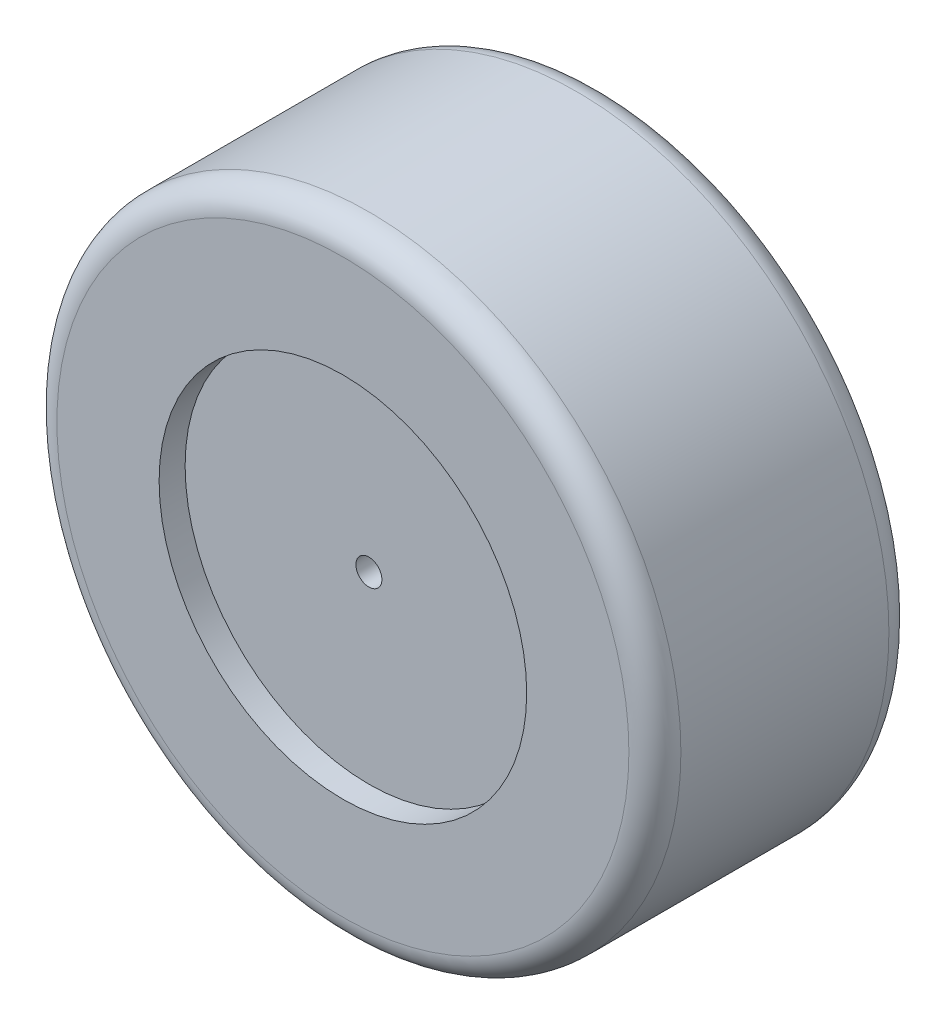
ISO-10303-21;
HEADER;
FILE_DESCRIPTION(('STEP AP214'),'2;1');
FILE_NAME('part.step','',(''),(''),'','','');
FILE_SCHEMA(('AUTOMOTIVE_DESIGN { 1 0 10303 214 1 1 1 1 }'));
ENDSEC;
DATA;
#1=APPLICATION_CONTEXT('core data for automotive mechanical design processes');
#2=APPLICATION_PROTOCOL_DEFINITION('international standard','automotive_design',2000,#1);
#3=PRODUCT_CONTEXT('',#1,'mechanical');
#4=PRODUCT('Part','Part','',(#3));
#5=PRODUCT_RELATED_PRODUCT_CATEGORY('part','',(#4));
#6=PRODUCT_DEFINITION_FORMATION('','',#4);
#7=PRODUCT_DEFINITION_CONTEXT('part definition',#1,'design');
#8=PRODUCT_DEFINITION('design','',#6,#7);
#9=PRODUCT_DEFINITION_SHAPE('','',#8);
#10=(LENGTH_UNIT() NAMED_UNIT(*) SI_UNIT(.MILLI.,.METRE.));
#11=(NAMED_UNIT(*) PLANE_ANGLE_UNIT() SI_UNIT($,.RADIAN.));
#12=(NAMED_UNIT(*) SI_UNIT($,.STERADIAN.) SOLID_ANGLE_UNIT());
#13=UNCERTAINTY_MEASURE_WITH_UNIT(LENGTH_MEASURE(1.E-05),#10,'distance_accuracy_value','');
#14=(GEOMETRIC_REPRESENTATION_CONTEXT(3) GLOBAL_UNCERTAINTY_ASSIGNED_CONTEXT((#13)) GLOBAL_UNIT_ASSIGNED_CONTEXT((#10,
#11,#12)) REPRESENTATION_CONTEXT('',''));
#15=CARTESIAN_POINT('',(0.,0.,0.));
#16=DIRECTION('',(0.,0.,1.));
#17=DIRECTION('',(1.,0.,0.));
#18=AXIS2_PLACEMENT_3D('',#15,#16,#17);
#19=CARTESIAN_POINT('',(0.,0.,50.));
#20=DIRECTION('',(0.,0.,-1.));
#21=DIRECTION('',(-1.,0.,0.));
#22=AXIS2_PLACEMENT_3D('',#19,#20,#21);
#23=CYLINDRICAL_SURFACE('',#22,60.);
#24=CARTESIAN_POINT('',(0.,0.,45.));
#25=DIRECTION('',(0.,0.,1.));
#26=DIRECTION('',(1.,0.,0.));
#27=AXIS2_PLACEMENT_3D('',#24,#25,#26);
#28=CIRCLE('',#27,60.);
#29=CARTESIAN_POINT('',(60.,0.,45.));
#30=VERTEX_POINT('',#29);
#31=EDGE_CURVE('E51',#30,#30,#28,.F.);
#32=ORIENTED_EDGE('',*,*,#31,.T.);
#33=EDGE_LOOP('',(#32));
#34=FACE_BOUND('',#33,.T.);
#35=CARTESIAN_POINT('',(0.,0.,5.));
#36=DIRECTION('',(0.,0.,1.));
#37=DIRECTION('',(1.,0.,0.));
#38=AXIS2_PLACEMENT_3D('',#35,#36,#37);
#39=CIRCLE('',#38,60.);
#40=CARTESIAN_POINT('',(60.,0.,5.));
#41=VERTEX_POINT('',#40);
#42=EDGE_CURVE('E56',#41,#41,#39,.T.);
#43=ORIENTED_EDGE('',*,*,#42,.T.);
#44=EDGE_LOOP('',(#43));
#45=FACE_BOUND('',#44,.T.);
#46=ADVANCED_FACE('F43',(#34,#45),#23,.T.);
#47=CARTESIAN_POINT('',(0.,0.,50.));
#48=DIRECTION('',(0.,0.,1.));
#49=DIRECTION('',(1.,0.,0.));
#50=AXIS2_PLACEMENT_3D('',#47,#48,#49);
#51=PLANE('',#50);
#52=CARTESIAN_POINT('',(0.,0.,50.));
#53=DIRECTION('',(0.,0.,1.));
#54=DIRECTION('',(1.,0.,0.));
#55=AXIS2_PLACEMENT_3D('',#52,#53,#54);
#56=CIRCLE('',#55,35.3445026529938);
#57=CARTESIAN_POINT('',(35.3445026529938,0.,50.));
#58=VERTEX_POINT('',#57);
#59=EDGE_CURVE('E68',#58,#58,#56,.T.);
#60=ORIENTED_EDGE('',*,*,#59,.F.);
#61=EDGE_LOOP('',(#60));
#62=FACE_BOUND('',#61,.T.);
#63=CARTESIAN_POINT('',(0.,0.,50.));
#64=DIRECTION('',(0.,0.,1.));
#65=DIRECTION('',(1.,0.,0.));
#66=AXIS2_PLACEMENT_3D('',#63,#64,#65);
#67=CIRCLE('',#66,55.);
#68=CARTESIAN_POINT('',(55.,0.,50.));
#69=VERTEX_POINT('',#68);
#70=EDGE_CURVE('E61',#69,#69,#67,.T.);
#71=ORIENTED_EDGE('',*,*,#70,.T.);
#72=EDGE_LOOP('',(#71));
#73=FACE_BOUND('',#72,.T.);
#74=ADVANCED_FACE('F104',(#62,#73),#51,.T.);
#75=CARTESIAN_POINT('',(0.,0.,0.));
#76=DIRECTION('',(0.,0.,1.));
#77=DIRECTION('',(1.,0.,0.));
#78=AXIS2_PLACEMENT_3D('',#75,#76,#77);
#79=PLANE('',#78);
#80=CARTESIAN_POINT('',(0.,0.,0.));
#81=DIRECTION('',(0.,0.,1.));
#82=DIRECTION('',(1.,0.,0.));
#83=AXIS2_PLACEMENT_3D('',#80,#81,#82);
#84=CIRCLE('',#83,2.5);
#85=CARTESIAN_POINT('',(2.5,0.,0.));
#86=VERTEX_POINT('',#85);
#87=EDGE_CURVE('E72',#86,#86,#84,.T.);
#88=ORIENTED_EDGE('',*,*,#87,.T.);
#89=EDGE_LOOP('',(#88));
#90=FACE_BOUND('',#89,.T.);
#91=CARTESIAN_POINT('',(0.,0.,0.));
#92=DIRECTION('',(0.,0.,1.));
#93=DIRECTION('',(1.,0.,0.));
#94=AXIS2_PLACEMENT_3D('',#91,#92,#93);
#95=CIRCLE('',#94,55.);
#96=CARTESIAN_POINT('',(55.,0.,0.));
#97=VERTEX_POINT('',#96);
#98=EDGE_CURVE('E10',#97,#97,#95,.F.);
#99=ORIENTED_EDGE('',*,*,#98,.T.);
#100=EDGE_LOOP('',(#99));
#101=FACE_BOUND('',#100,.T.);
#102=ADVANCED_FACE('F84',(#90,#101),#79,.F.);
#103=CARTESIAN_POINT('',(0.,0.,45.));
#104=DIRECTION('',(0.,0.,1.));
#105=DIRECTION('',(1.,0.,0.));
#106=AXIS2_PLACEMENT_3D('',#103,#104,#105);
#107=TOROIDAL_SURFACE('',#106,55.,5.);
#108=ORIENTED_EDGE('',*,*,#31,.F.);
#109=EDGE_LOOP('',(#108));
#110=FACE_BOUND('',#109,.T.);
#111=ORIENTED_EDGE('',*,*,#70,.F.);
#112=EDGE_LOOP('',(#111));
#113=FACE_BOUND('',#112,.T.);
#114=ADVANCED_FACE('F110',(#110,#113),#107,.T.);
#115=CARTESIAN_POINT('',(0.,0.,5.));
#116=DIRECTION('',(0.,0.,1.));
#117=DIRECTION('',(1.,0.,0.));
#118=AXIS2_PLACEMENT_3D('',#115,#116,#117);
#119=TOROIDAL_SURFACE('',#118,55.,5.);
#120=ORIENTED_EDGE('',*,*,#98,.F.);
#121=EDGE_LOOP('',(#120));
#122=FACE_BOUND('',#121,.T.);
#123=ORIENTED_EDGE('',*,*,#42,.F.);
#124=EDGE_LOOP('',(#123));
#125=FACE_BOUND('',#124,.T.);
#126=ADVANCED_FACE('F45',(#122,#125),#119,.T.);
#127=CARTESIAN_POINT('',(0.,0.,45.));
#128=DIRECTION('',(0.,0.,1.));
#129=DIRECTION('',(1.,0.,0.));
#130=AXIS2_PLACEMENT_3D('',#127,#128,#129);
#131=CYLINDRICAL_SURFACE('',#130,35.3445026529938);
#132=CARTESIAN_POINT('',(0.,0.,45.));
#133=DIRECTION('',(0.,0.,1.));
#134=DIRECTION('',(1.,0.,0.));
#135=AXIS2_PLACEMENT_3D('',#132,#133,#134);
#136=CIRCLE('',#135,35.3445026529938);
#137=CARTESIAN_POINT('',(35.3445026529938,0.,45.));
#138=VERTEX_POINT('',#137);
#139=EDGE_CURVE('E67',#138,#138,#136,.T.);
#140=ORIENTED_EDGE('',*,*,#139,.F.);
#141=EDGE_LOOP('',(#140));
#142=FACE_BOUND('',#141,.T.);
#143=ORIENTED_EDGE('',*,*,#59,.T.);
#144=EDGE_LOOP('',(#143));
#145=FACE_BOUND('',#144,.T.);
#146=ADVANCED_FACE('F95',(#142,#145),#131,.F.);
#147=CARTESIAN_POINT('',(0.,0.,45.));
#148=DIRECTION('',(0.,0.,1.));
#149=DIRECTION('',(1.,0.,0.));
#150=AXIS2_PLACEMENT_3D('',#147,#148,#149);
#151=PLANE('',#150);
#152=CARTESIAN_POINT('',(0.,0.,45.));
#153=DIRECTION('',(0.,0.,1.));
#154=DIRECTION('',(1.,0.,0.));
#155=AXIS2_PLACEMENT_3D('',#152,#153,#154);
#156=CIRCLE('',#155,2.5);
#157=CARTESIAN_POINT('',(2.5,0.,45.));
#158=VERTEX_POINT('',#157);
#159=EDGE_CURVE('E76',#158,#158,#156,.T.);
#160=ORIENTED_EDGE('',*,*,#159,.F.);
#161=EDGE_LOOP('',(#160));
#162=FACE_BOUND('',#161,.T.);
#163=ORIENTED_EDGE('',*,*,#139,.T.);
#164=EDGE_LOOP('',(#163));
#165=FACE_BOUND('',#164,.T.);
#166=ADVANCED_FACE('F89',(#162,#165),#151,.T.);
#167=CARTESIAN_POINT('',(0.,0.,0.));
#168=DIRECTION('',(0.,0.,1.));
#169=DIRECTION('',(1.,0.,0.));
#170=AXIS2_PLACEMENT_3D('',#167,#168,#169);
#171=CYLINDRICAL_SURFACE('',#170,2.5);
#172=CARTESIAN_POINT('',(2.5,0.,0.));
#173=CARTESIAN_POINT('',(2.5,0.,0.468749999999999));
#174=CARTESIAN_POINT('',(2.5,0.,0.9375));
#175=CARTESIAN_POINT('',(2.5,0.,1.875));
#176=CARTESIAN_POINT('',(2.5,0.,2.34375));
#177=CARTESIAN_POINT('',(2.5,0.,3.28125));
#178=CARTESIAN_POINT('',(2.5,0.,3.75));
#179=CARTESIAN_POINT('',(2.5,0.,4.6875));
#180=CARTESIAN_POINT('',(2.5,0.,5.15625));
#181=CARTESIAN_POINT('',(2.5,0.,6.09375));
#182=CARTESIAN_POINT('',(2.5,0.,6.5625));
#183=CARTESIAN_POINT('',(2.5,0.,7.5));
#184=CARTESIAN_POINT('',(2.5,0.,7.96875));
#185=CARTESIAN_POINT('',(2.5,0.,8.90625));
#186=CARTESIAN_POINT('',(2.5,0.,9.375));
#187=CARTESIAN_POINT('',(2.5,0.,10.3125));
#188=CARTESIAN_POINT('',(2.5,0.,10.78125));
#189=CARTESIAN_POINT('',(2.5,0.,11.71875));
#190=CARTESIAN_POINT('',(2.5,0.,12.1875));
#191=CARTESIAN_POINT('',(2.5,0.,13.125));
#192=CARTESIAN_POINT('',(2.5,0.,13.59375));
#193=CARTESIAN_POINT('',(2.5,0.,14.53125));
#194=CARTESIAN_POINT('',(2.5,0.,15.));
#195=CARTESIAN_POINT('',(2.5,0.,15.9375));
#196=CARTESIAN_POINT('',(2.5,0.,16.40625));
#197=CARTESIAN_POINT('',(2.5,0.,17.34375));
#198=CARTESIAN_POINT('',(2.5,0.,17.8125));
#199=CARTESIAN_POINT('',(2.5,0.,18.75));
#200=CARTESIAN_POINT('',(2.5,0.,19.21875));
#201=CARTESIAN_POINT('',(2.5,0.,20.15625));
#202=CARTESIAN_POINT('',(2.5,0.,20.625));
#203=CARTESIAN_POINT('',(2.5,0.,21.5625));
#204=CARTESIAN_POINT('',(2.5,0.,22.03125));
#205=CARTESIAN_POINT('',(2.5,0.,22.96875));
#206=CARTESIAN_POINT('',(2.5,0.,23.4375));
#207=CARTESIAN_POINT('',(2.5,0.,24.375));
#208=CARTESIAN_POINT('',(2.5,0.,24.84375));
#209=CARTESIAN_POINT('',(2.5,0.,25.78125));
#210=CARTESIAN_POINT('',(2.5,0.,26.25));
#211=CARTESIAN_POINT('',(2.5,0.,27.1875));
#212=CARTESIAN_POINT('',(2.5,0.,27.65625));
#213=CARTESIAN_POINT('',(2.5,0.,28.59375));
#214=CARTESIAN_POINT('',(2.5,0.,29.0625));
#215=CARTESIAN_POINT('',(2.5,0.,30.));
#216=CARTESIAN_POINT('',(2.5,0.,30.46875));
#217=CARTESIAN_POINT('',(2.5,0.,31.40625));
#218=CARTESIAN_POINT('',(2.5,0.,31.875));
#219=CARTESIAN_POINT('',(2.5,0.,32.8125));
#220=CARTESIAN_POINT('',(2.5,0.,33.28125));
#221=CARTESIAN_POINT('',(2.5,0.,34.21875));
#222=CARTESIAN_POINT('',(2.5,0.,34.6875));
#223=CARTESIAN_POINT('',(2.5,0.,35.625));
#224=CARTESIAN_POINT('',(2.5,0.,36.09375));
#225=CARTESIAN_POINT('',(2.5,0.,37.03125));
#226=CARTESIAN_POINT('',(2.5,0.,37.5));
#227=CARTESIAN_POINT('',(2.5,0.,38.4375));
#228=CARTESIAN_POINT('',(2.5,0.,38.90625));
#229=CARTESIAN_POINT('',(2.5,0.,39.84375));
#230=CARTESIAN_POINT('',(2.5,0.,40.3125));
#231=CARTESIAN_POINT('',(2.5,0.,41.25));
#232=CARTESIAN_POINT('',(2.5,0.,41.71875));
#233=CARTESIAN_POINT('',(2.5,0.,42.65625));
#234=CARTESIAN_POINT('',(2.5,0.,43.125));
#235=CARTESIAN_POINT('',(2.5,0.,44.0625));
#236=CARTESIAN_POINT('',(2.5,0.,44.53125));
#237=CARTESIAN_POINT('',(2.5,0.,45.));
#238=B_SPLINE_CURVE_WITH_KNOTS('',3,(#172,#173,#174,#175,#176,#177,#178,#179,#180,#181,#182,
#183,#184,#185,#186,#187,#188,#189,#190,#191,#192,#193,#194,#195,#196,#197,#198,#199,#200,#201,
#202,#203,#204,#205,#206,#207,#208,#209,#210,#211,#212,#213,#214,#215,#216,#217,#218,#219,#220,
#221,#222,#223,#224,#225,#226,#227,#228,#229,#230,#231,#232,#233,#234,#235,#236,#237),
.UNSPECIFIED.,.F.,.F.,(4,2,2,2,2,2,2,2,2,2,2,2,2,2,2,2,2,2,2,2,2,2,2,2,2,2,2,2,2,2,2,2,4),(0.,
1.40625,2.8125,4.21875,5.625,7.03125,8.4375,9.84375,11.25,12.65625,14.0625,15.46875,16.875,
18.28125,19.6875,21.09375,22.5,23.90625,25.3125,26.71875,28.125,29.53125,30.9375,32.34375,33.75,
35.15625,36.5625,37.96875,39.375,40.78125,42.1875,43.59375,45.),.UNSPECIFIED.);
#239=EDGE_CURVE('BSEAM86',#86,#158,#238,.T.);
#240=ORIENTED_EDGE('',*,*,#87,.F.);
#241=ORIENTED_EDGE('',*,*,#159,.T.);
#242=ORIENTED_EDGE('',*,*,#239,.T.);
#243=ORIENTED_EDGE('',*,*,#239,.F.);
#244=EDGE_LOOP('',(#240,#242,#241,#243));
#245=FACE_BOUND('',#244,.T.);
#246=ADVANCED_FACE('F86',(#245),#171,.F.);
#247=CLOSED_SHELL('',(#46,#74,#102,#114,#126,#146,#166,#246));
#248=MANIFOLD_SOLID_BREP('B2',#247);
#249=ADVANCED_BREP_SHAPE_REPRESENTATION('',(#18,#248),#14);
#250=SHAPE_DEFINITION_REPRESENTATION(#9,#249);
ENDSEC;
END-ISO-10303-21;
